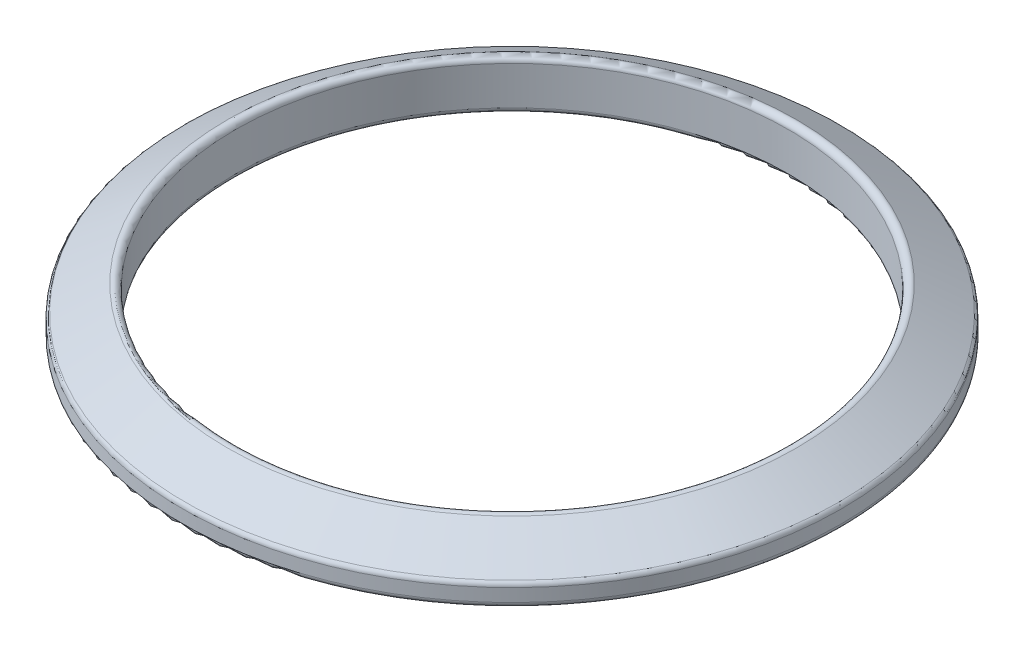
ISO-10303-21;
HEADER;
FILE_DESCRIPTION(('STEP AP214'),'2;1');
FILE_NAME('part.step','',(''),(''),'','','');
FILE_SCHEMA(('AUTOMOTIVE_DESIGN { 1 0 10303 214 1 1 1 1 }'));
ENDSEC;
DATA;
#1=APPLICATION_CONTEXT('core data for automotive mechanical design processes');
#2=APPLICATION_PROTOCOL_DEFINITION('international standard','automotive_design',2000,#1);
#3=PRODUCT_CONTEXT('',#1,'mechanical');
#4=PRODUCT('Part','Part','',(#3));
#5=PRODUCT_RELATED_PRODUCT_CATEGORY('part','',(#4));
#6=PRODUCT_DEFINITION_FORMATION('','',#4);
#7=PRODUCT_DEFINITION_CONTEXT('part definition',#1,'design');
#8=PRODUCT_DEFINITION('design','',#6,#7);
#9=PRODUCT_DEFINITION_SHAPE('','',#8);
#10=(LENGTH_UNIT() NAMED_UNIT(*) SI_UNIT(.MILLI.,.METRE.));
#11=(NAMED_UNIT(*) PLANE_ANGLE_UNIT() SI_UNIT($,.RADIAN.));
#12=(NAMED_UNIT(*) SI_UNIT($,.STERADIAN.) SOLID_ANGLE_UNIT());
#13=UNCERTAINTY_MEASURE_WITH_UNIT(LENGTH_MEASURE(1.E-05),#10,'distance_accuracy_value','');
#14=(GEOMETRIC_REPRESENTATION_CONTEXT(3) GLOBAL_UNCERTAINTY_ASSIGNED_CONTEXT((#13)) GLOBAL_UNIT_ASSIGNED_CONTEXT((#10,
#11,#12)) REPRESENTATION_CONTEXT('',''));
#15=CARTESIAN_POINT('',(0.,0.,0.));
#16=DIRECTION('',(0.,0.,1.));
#17=DIRECTION('',(1.,0.,0.));
#18=AXIS2_PLACEMENT_3D('',#15,#16,#17);
#19=CARTESIAN_POINT('',(0.,0.5,0.));
#20=DIRECTION('',(0.,1.,0.));
#21=DIRECTION('',(-0.999986508110946,0.,-0.00519457371472424));
#22=AXIS2_PLACEMENT_3D('',#19,#20,#21);
#23=TOROIDAL_SURFACE('',#22,26.5,0.5);
#24=CARTESIAN_POINT('',(0.,2.131073095768E-13,0.));
#25=DIRECTION('',(0.,1.,0.));
#26=DIRECTION('',(-1.,0.,0.));
#27=AXIS2_PLACEMENT_3D('',#24,#25,#26);
#28=CIRCLE('',#27,26.49999954002);
#29=CARTESIAN_POINT('',(26.4996420049663,2.13093431788991E-13,0.137656201050789));
#30=VERTEX_POINT('',#29);
#31=EDGE_CURVE('E112',#30,#30,#28,.T.);
#32=ORIENTED_EDGE('',*,*,#31,.F.);
#33=CARTESIAN_POINT('',(26.4996424649401,0.5,0.137656203440189));
#34=DIRECTION('',(0.00519457371472412,0.,-0.999986508110946));
#35=DIRECTION('',(0.999986508110946,0.,0.00519457371472412));
#36=AXIS2_PLACEMENT_3D('',#33,#34,#35);
#37=CIRCLE('',#36,0.5);
#38=CARTESIAN_POINT('',(25.9996492108846,0.5,0.135058916582827));
#39=VERTEX_POINT('',#38);
#40=EDGE_CURVE('E11',#30,#39,#37,.T.);
#41=ORIENTED_EDGE('',*,*,#40,.T.);
#42=CARTESIAN_POINT('',(0.,0.5,0.));
#43=DIRECTION('',(0.,1.,0.));
#44=DIRECTION('',(1.,0.,0.));
#45=AXIS2_PLACEMENT_3D('',#42,#43,#44);
#46=CIRCLE('',#45,26.);
#47=CARTESIAN_POINT('',(-26.,0.5,0.));
#48=VERTEX_POINT('',#47);
#49=EDGE_CURVE('E157',#39,#48,#46,.T.);
#50=ORIENTED_EDGE('',*,*,#49,.T.);
#51=CARTESIAN_POINT('',(0.,0.5,0.));
#52=DIRECTION('',(0.,1.,0.));
#53=DIRECTION('',(1.,0.,0.));
#54=AXIS2_PLACEMENT_3D('',#51,#52,#53);
#55=CIRCLE('',#54,26.);
#56=EDGE_CURVE('E143',#48,#39,#55,.T.);
#57=ORIENTED_EDGE('',*,*,#56,.T.);
#58=ORIENTED_EDGE('',*,*,#40,.F.);
#59=EDGE_LOOP('',(#32,#41,#50,#57,#58));
#60=FACE_BOUND('',#59,.T.);
#61=ADVANCED_FACE('F17',(#60),#23,.T.);
#62=CARTESIAN_POINT('',(0.,-0.25,0.));
#63=DIRECTION('',(0.,1.,0.));
#64=DIRECTION('',(1.,0.,0.));
#65=AXIS2_PLACEMENT_3D('',#62,#63,#64);
#66=CYLINDRICAL_SURFACE('',#65,26.);
#67=ORIENTED_EDGE('',*,*,#49,.F.);
#68=ORIENTED_EDGE('',*,*,#56,.F.);
#69=DIRECTION('',(0.,1.,0.));
#70=VECTOR('',#69,1.);
#71=CARTESIAN_POINT('',(-26.,-0.25,0.));
#72=LINE('',#71,#70);
#73=CARTESIAN_POINT('',(-26.,4.116904810515,0.));
#74=VERTEX_POINT('',#73);
#75=EDGE_CURVE('E28',#48,#74,#72,.T.);
#76=ORIENTED_EDGE('',*,*,#75,.T.);
#77=CARTESIAN_POINT('',(0.,4.116904810515,0.));
#78=DIRECTION('',(0.,1.,0.));
#79=DIRECTION('',(1.,0.,0.));
#80=AXIS2_PLACEMENT_3D('',#77,#78,#79);
#81=CIRCLE('',#80,26.);
#82=CARTESIAN_POINT('',(-25.9997080535162,4.116904810515,-0.123211736148873));
#83=VERTEX_POINT('',#82);
#84=EDGE_CURVE('E152',#74,#83,#81,.T.);
#85=ORIENTED_EDGE('',*,*,#84,.T.);
#86=CARTESIAN_POINT('',(0.,4.116904810515,0.));
#87=DIRECTION('',(0.,1.,0.));
#88=DIRECTION('',(1.,0.,0.));
#89=AXIS2_PLACEMENT_3D('',#86,#87,#88);
#90=CIRCLE('',#89,26.);
#91=EDGE_CURVE('E149',#83,#74,#90,.T.);
#92=ORIENTED_EDGE('',*,*,#91,.T.);
#93=ORIENTED_EDGE('',*,*,#75,.F.);
#94=EDGE_LOOP('',(#67,#68,#76,#85,#92,#93));
#95=FACE_BOUND('',#94,.T.);
#96=ADVANCED_FACE('F172',(#95),#66,.F.);
#97=CARTESIAN_POINT('',(0.,4.116904810515,0.));
#98=DIRECTION('',(0.,1.,0.));
#99=DIRECTION('',(0.999988771289085,0.,0.00473891292880293));
#100=AXIS2_PLACEMENT_3D('',#97,#98,#99);
#101=TOROIDAL_SURFACE('',#100,26.5,0.5);
#102=ORIENTED_EDGE('',*,*,#84,.F.);
#103=ORIENTED_EDGE('',*,*,#91,.F.);
#104=CARTESIAN_POINT('',(-26.4997024391607,4.116904810515,-0.125581192613274));
#105=DIRECTION('',(-0.00473891292880281,0.,0.999988771289085));
#106=DIRECTION('',(-0.999988771289085,0.,-0.00473891292880281));
#107=AXIS2_PLACEMENT_3D('',#104,#105,#106);
#108=CIRCLE('',#107,0.5);
#109=CARTESIAN_POINT('',(-26.7569472108111,4.545651403875,-0.126800266876148));
#110=VERTEX_POINT('',#109);
#111=EDGE_CURVE('E151',#83,#110,#108,.T.);
#112=ORIENTED_EDGE('',*,*,#111,.T.);
#113=CARTESIAN_POINT('',(0.,4.545651403875,0.));
#114=DIRECTION('',(0.,1.,0.));
#115=DIRECTION('',(1.,0.,0.));
#116=AXIS2_PLACEMENT_3D('',#113,#114,#115);
#117=CIRCLE('',#116,26.75724766021);
#118=CARTESIAN_POINT('',(26.7572476602108,4.54565140387635,0.));
#119=VERTEX_POINT('',#118);
#120=EDGE_CURVE('E131',#110,#119,#117,.T.);
#121=ORIENTED_EDGE('',*,*,#120,.T.);
#122=CARTESIAN_POINT('',(0.,4.545651403875,0.));
#123=DIRECTION('',(0.,1.,0.));
#124=DIRECTION('',(1.,0.,0.));
#125=AXIS2_PLACEMENT_3D('',#122,#123,#124);
#126=CIRCLE('',#125,26.75724766021);
#127=EDGE_CURVE('E140',#119,#110,#126,.T.);
#128=ORIENTED_EDGE('',*,*,#127,.T.);
#129=ORIENTED_EDGE('',*,*,#111,.F.);
#130=EDGE_LOOP('',(#102,#103,#112,#121,#128,#129));
#131=FACE_BOUND('',#130,.T.);
#132=ADVANCED_FACE('F178',(#131),#101,.T.);
#133=CARTESIAN_POINT('',(0.,3.345651452837,0.));
#134=DIRECTION('',(0.,-1.,0.));
#135=DIRECTION('',(-1.,0.,0.));
#136=AXIS2_PLACEMENT_3D('',#133,#134,#135);
#137=CONICAL_SURFACE('',#136,28.75724757861,1.03037682652437);
#138=CARTESIAN_POINT('',(0.,2.145651412848,0.));
#139=DIRECTION('',(0.,1.,0.));
#140=DIRECTION('',(1.,0.,0.));
#141=AXIS2_PLACEMENT_3D('',#138,#139,#140);
#142=CIRCLE('',#141,30.75724764525);
#143=CARTESIAN_POINT('',(-30.7569557387077,2.145651412848,-0.134001486596586));
#144=VERTEX_POINT('',#143);
#145=CARTESIAN_POINT('',(30.7572476452523,2.14565141285179,0.));
#146=VERTEX_POINT('',#145);
#147=EDGE_CURVE('E126',#144,#146,#142,.T.);
#148=ORIENTED_EDGE('',*,*,#147,.T.);
#149=DIRECTION('',(-0.857492925712576,0.514495755427474,0.));
#150=VECTOR('',#149,1.);
#151=CARTESIAN_POINT('',(28.75724757861,3.345651452837,0.));
#152=LINE('',#151,#150);
#153=EDGE_CURVE('E127',#146,#119,#152,.T.);
#154=ORIENTED_EDGE('',*,*,#153,.T.);
#155=ORIENTED_EDGE('',*,*,#120,.F.);
#156=ORIENTED_EDGE('',*,*,#127,.F.);
#157=ORIENTED_EDGE('',*,*,#153,.F.);
#158=CARTESIAN_POINT('',(0.,2.145651412848,0.));
#159=DIRECTION('',(0.,1.,0.));
#160=DIRECTION('',(1.,0.,0.));
#161=AXIS2_PLACEMENT_3D('',#158,#159,#160);
#162=CIRCLE('',#161,30.75724764525);
#163=EDGE_CURVE('E132',#146,#144,#162,.T.);
#164=ORIENTED_EDGE('',*,*,#163,.T.);
#165=EDGE_LOOP('',(#148,#154,#155,#156,#157,#164));
#166=FACE_BOUND('',#165,.T.);
#167=ADVANCED_FACE('F185',(#166),#137,.T.);
#168=CARTESIAN_POINT('',(0.,1.716904810515,0.));
#169=DIRECTION('',(0.,1.,0.));
#170=DIRECTION('',(0.999990509341225,0.,0.00435674505541411));
#171=AXIS2_PLACEMENT_3D('',#168,#169,#170);
#172=TOROIDAL_SURFACE('',#171,30.5,0.5);
#173=ORIENTED_EDGE('',*,*,#147,.F.);
#174=CARTESIAN_POINT('',(-30.4997105349074,1.716904810515,-0.132880724190127));
#175=DIRECTION('',(-0.00435674505541398,0.,0.999990509341225));
#176=DIRECTION('',(-0.999990509341225,0.,-0.00435674505541398));
#177=AXIS2_PLACEMENT_3D('',#174,#175,#176);
#178=CIRCLE('',#177,0.5);
#179=CARTESIAN_POINT('',(-30.999705789578,1.716904815212,-0.135059096717834));
#180=VERTEX_POINT('',#179);
#181=EDGE_CURVE('E21',#144,#180,#178,.T.);
#182=ORIENTED_EDGE('',*,*,#181,.T.);
#183=CARTESIAN_POINT('',(0.,1.716904815212,0.));
#184=DIRECTION('',(0.,1.,0.));
#185=DIRECTION('',(1.,0.,0.));
#186=AXIS2_PLACEMENT_3D('',#183,#184,#185);
#187=CIRCLE('',#186,31.);
#188=CARTESIAN_POINT('',(-31.,1.716904815212,0.));
#189=VERTEX_POINT('',#188);
#190=EDGE_CURVE('E101',#180,#189,#187,.T.);
#191=ORIENTED_EDGE('',*,*,#190,.T.);
#192=CARTESIAN_POINT('',(0.,1.716904815212,0.));
#193=DIRECTION('',(0.,1.,0.));
#194=DIRECTION('',(1.,0.,0.));
#195=AXIS2_PLACEMENT_3D('',#192,#193,#194);
#196=CIRCLE('',#195,31.);
#197=EDGE_CURVE('E99',#189,#180,#196,.T.);
#198=ORIENTED_EDGE('',*,*,#197,.T.);
#199=ORIENTED_EDGE('',*,*,#181,.F.);
#200=ORIENTED_EDGE('',*,*,#163,.F.);
#201=EDGE_LOOP('',(#173,#182,#191,#198,#199,#200));
#202=FACE_BOUND('',#201,.T.);
#203=ADVANCED_FACE('F190',(#202),#172,.T.);
#204=CARTESIAN_POINT('',(0.,-0.25,0.));
#205=DIRECTION('',(0.,1.,0.));
#206=DIRECTION('',(1.,0.,0.));
#207=AXIS2_PLACEMENT_3D('',#204,#205,#206);
#208=CYLINDRICAL_SURFACE('',#207,31.);
#209=ORIENTED_EDGE('',*,*,#197,.F.);
#210=DIRECTION('',(0.,-1.,0.));
#211=VECTOR('',#210,1.);
#212=CARTESIAN_POINT('',(-31.,-0.25,0.));
#213=LINE('',#212,#211);
#214=CARTESIAN_POINT('',(-31.,0.5,0.));
#215=VERTEX_POINT('',#214);
#216=EDGE_CURVE('E92',#189,#215,#213,.T.);
#217=ORIENTED_EDGE('',*,*,#216,.T.);
#218=CARTESIAN_POINT('',(0.,0.5,0.));
#219=DIRECTION('',(0.,1.,0.));
#220=DIRECTION('',(1.,0.,0.));
#221=AXIS2_PLACEMENT_3D('',#218,#219,#220);
#222=CIRCLE('',#221,31.);
#223=CARTESIAN_POINT('',(-30.9996767266438,0.5,-0.141572750132065));
#224=VERTEX_POINT('',#223);
#225=EDGE_CURVE('E96',#215,#224,#222,.T.);
#226=ORIENTED_EDGE('',*,*,#225,.T.);
#227=CARTESIAN_POINT('',(0.,0.5,0.));
#228=DIRECTION('',(0.,1.,0.));
#229=DIRECTION('',(1.,0.,0.));
#230=AXIS2_PLACEMENT_3D('',#227,#228,#229);
#231=CIRCLE('',#230,31.);
#232=EDGE_CURVE('E104',#224,#215,#231,.T.);
#233=ORIENTED_EDGE('',*,*,#232,.T.);
#234=ORIENTED_EDGE('',*,*,#216,.F.);
#235=ORIENTED_EDGE('',*,*,#190,.F.);
#236=EDGE_LOOP('',(#209,#217,#226,#233,#234,#235));
#237=FACE_BOUND('',#236,.T.);
#238=ADVANCED_FACE('F94',(#237),#208,.T.);
#239=CARTESIAN_POINT('',(0.,0.5,0.));
#240=DIRECTION('',(0.,1.,0.));
#241=DIRECTION('',(0.999989571827219,0.,0.00456686290748609));
#242=AXIS2_PLACEMENT_3D('',#239,#240,#241);
#243=TOROIDAL_SURFACE('',#242,30.5,0.5);
#244=ORIENTED_EDGE('',*,*,#225,.F.);
#245=ORIENTED_EDGE('',*,*,#232,.F.);
#246=CARTESIAN_POINT('',(-30.4996819407302,0.5,-0.139289318678322));
#247=DIRECTION('',(-0.00456686290748596,0.,0.999989571827219));
#248=DIRECTION('',(-0.999989571827219,0.,-0.00456686290748596));
#249=AXIS2_PLACEMENT_3D('',#246,#247,#248);
#250=CIRCLE('',#249,0.5);
#251=CARTESIAN_POINT('',(-30.4996819931896,0.,-0.1392893189179));
#252=VERTEX_POINT('',#251);
#253=EDGE_CURVE('E107',#224,#252,#250,.T.);
#254=ORIENTED_EDGE('',*,*,#253,.T.);
#255=CARTESIAN_POINT('',(0.,0.,0.));
#256=DIRECTION('',(0.,1.,0.));
#257=DIRECTION('',(1.,0.,0.));
#258=AXIS2_PLACEMENT_3D('',#255,#256,#257);
#259=CIRCLE('',#258,30.50000005246);
#260=EDGE_CURVE('E119',#252,#252,#259,.T.);
#261=ORIENTED_EDGE('',*,*,#260,.T.);
#262=ORIENTED_EDGE('',*,*,#253,.F.);
#263=EDGE_LOOP('',(#244,#245,#254,#261,#262));
#264=FACE_BOUND('',#263,.T.);
#265=ADVANCED_FACE('F109',(#264),#243,.T.);
#266=CARTESIAN_POINT('',(0.,0.,0.));
#267=DIRECTION('',(0.,1.,0.));
#268=DIRECTION('',(1.,0.,0.));
#269=AXIS2_PLACEMENT_3D('',#266,#267,#268);
#270=PLANE('',#269);
#271=ORIENTED_EDGE('',*,*,#31,.T.);
#272=EDGE_LOOP('',(#271));
#273=FACE_BOUND('',#272,.T.);
#274=ORIENTED_EDGE('',*,*,#260,.F.);
#275=EDGE_LOOP('',(#274));
#276=FACE_BOUND('',#275,.T.);
#277=ADVANCED_FACE('F19',(#273,#276),#270,.F.);
#278=CLOSED_SHELL('',(#61,#96,#132,#167,#203,#238,#265,#277));
#279=MANIFOLD_SOLID_BREP('B1',#278);
#280=ADVANCED_BREP_SHAPE_REPRESENTATION('',(#18,#279),#14);
#281=SHAPE_DEFINITION_REPRESENTATION(#9,#280);
ENDSEC;
END-ISO-10303-21;
